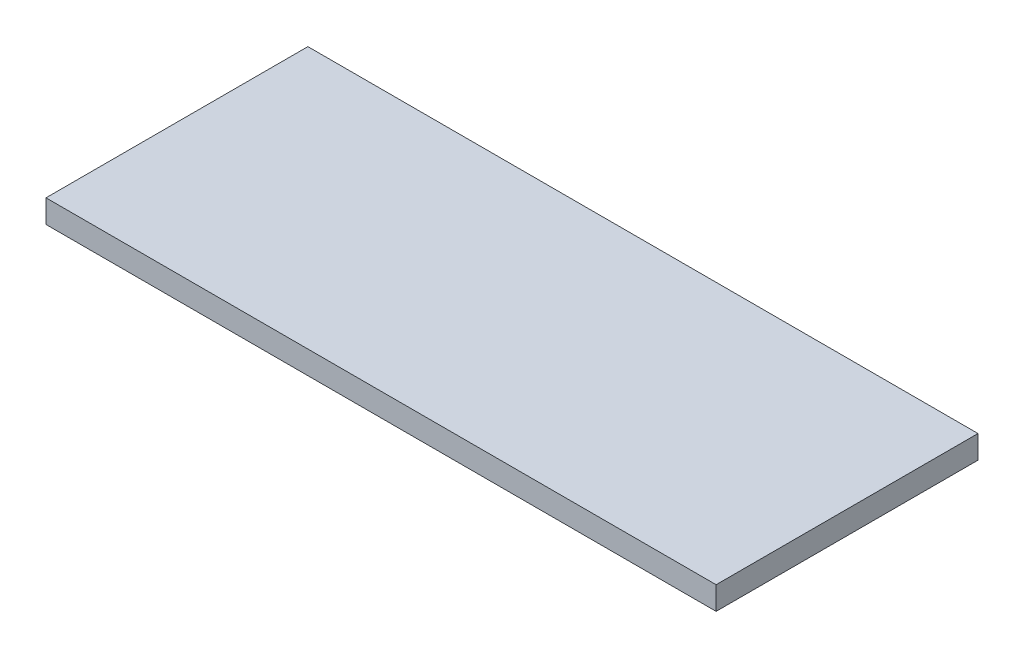
ISO-10303-21;
HEADER;
FILE_DESCRIPTION(('STEP AP214'),'2;1');
FILE_NAME('part.step','',(''),(''),'','','');
FILE_SCHEMA(('AUTOMOTIVE_DESIGN { 1 0 10303 214 1 1 1 1 }'));
ENDSEC;
DATA;
#1=APPLICATION_CONTEXT('core data for automotive mechanical design processes');
#2=APPLICATION_PROTOCOL_DEFINITION('international standard','automotive_design',2000,#1);
#3=PRODUCT_CONTEXT('',#1,'mechanical');
#4=PRODUCT('Part','Part','',(#3));
#5=PRODUCT_RELATED_PRODUCT_CATEGORY('part','',(#4));
#6=PRODUCT_DEFINITION_FORMATION('','',#4);
#7=PRODUCT_DEFINITION_CONTEXT('part definition',#1,'design');
#8=PRODUCT_DEFINITION('design','',#6,#7);
#9=PRODUCT_DEFINITION_SHAPE('','',#8);
#10=(LENGTH_UNIT() NAMED_UNIT(*) SI_UNIT(.MILLI.,.METRE.));
#11=(NAMED_UNIT(*) PLANE_ANGLE_UNIT() SI_UNIT($,.RADIAN.));
#12=(NAMED_UNIT(*) SI_UNIT($,.STERADIAN.) SOLID_ANGLE_UNIT());
#13=UNCERTAINTY_MEASURE_WITH_UNIT(LENGTH_MEASURE(1.E-05),#10,'distance_accuracy_value','');
#14=(GEOMETRIC_REPRESENTATION_CONTEXT(3) GLOBAL_UNCERTAINTY_ASSIGNED_CONTEXT((#13)) GLOBAL_UNIT_ASSIGNED_CONTEXT((#10,
#11,#12)) REPRESENTATION_CONTEXT('',''));
#15=CARTESIAN_POINT('',(0.,0.,0.));
#16=DIRECTION('',(0.,0.,1.));
#17=DIRECTION('',(1.,0.,0.));
#18=AXIS2_PLACEMENT_3D('',#15,#16,#17);
#19=CARTESIAN_POINT('',(0.,19.05,0.));
#20=DIRECTION('',(1.,0.,0.));
#21=DIRECTION('',(0.,0.,-1.));
#22=AXIS2_PLACEMENT_3D('',#19,#20,#21);
#23=PLANE('',#22);
#24=DIRECTION('',(0.,0.,1.));
#25=VECTOR('',#24,1.);
#26=CARTESIAN_POINT('',(0.,0.,0.));
#27=LINE('',#26,#25);
#28=CARTESIAN_POINT('',(0.,0.,-215.9));
#29=VERTEX_POINT('',#28);
#30=CARTESIAN_POINT('',(0.,0.,0.));
#31=VERTEX_POINT('',#30);
#32=EDGE_CURVE('E107',#29,#31,#27,.T.);
#33=ORIENTED_EDGE('',*,*,#32,.T.);
#34=DIRECTION('',(0.,-1.,0.));
#35=VECTOR('',#34,1.);
#36=CARTESIAN_POINT('',(0.,19.05,0.));
#37=LINE('',#36,#35);
#38=CARTESIAN_POINT('',(0.,19.05,0.));
#39=VERTEX_POINT('',#38);
#40=EDGE_CURVE('E11',#39,#31,#37,.T.);
#41=ORIENTED_EDGE('',*,*,#40,.F.);
#42=DIRECTION('',(0.,0.,1.));
#43=VECTOR('',#42,1.);
#44=CARTESIAN_POINT('',(0.,19.05,0.));
#45=LINE('',#44,#43);
#46=CARTESIAN_POINT('',(0.,19.05,-215.9));
#47=VERTEX_POINT('',#46);
#48=EDGE_CURVE('E91',#47,#39,#45,.T.);
#49=ORIENTED_EDGE('',*,*,#48,.F.);
#50=DIRECTION('',(0.,-1.,0.));
#51=VECTOR('',#50,1.);
#52=CARTESIAN_POINT('',(0.,19.05,-215.9));
#53=LINE('',#52,#51);
#54=EDGE_CURVE('E103',#47,#29,#53,.T.);
#55=ORIENTED_EDGE('',*,*,#54,.T.);
#56=EDGE_LOOP('',(#33,#41,#49,#55));
#57=FACE_BOUND('',#56,.T.);
#58=ADVANCED_FACE('F39',(#57),#23,.F.);
#59=CARTESIAN_POINT('',(0.,19.05,0.));
#60=DIRECTION('',(0.,0.,-1.));
#61=DIRECTION('',(-1.,0.,0.));
#62=AXIS2_PLACEMENT_3D('',#59,#60,#61);
#63=PLANE('',#62);
#64=DIRECTION('',(1.,0.,0.));
#65=VECTOR('',#64,1.);
#66=CARTESIAN_POINT('',(0.,0.,0.));
#67=LINE('',#66,#65);
#68=CARTESIAN_POINT('',(552.45,0.,0.));
#69=VERTEX_POINT('',#68);
#70=EDGE_CURVE('E96',#31,#69,#67,.T.);
#71=ORIENTED_EDGE('',*,*,#70,.T.);
#72=DIRECTION('',(0.,-1.,0.));
#73=VECTOR('',#72,1.);
#74=CARTESIAN_POINT('',(552.45,19.05,0.));
#75=LINE('',#74,#73);
#76=CARTESIAN_POINT('',(552.45,19.05,0.));
#77=VERTEX_POINT('',#76);
#78=EDGE_CURVE('E48',#77,#69,#75,.T.);
#79=ORIENTED_EDGE('',*,*,#78,.F.);
#80=DIRECTION('',(1.,0.,0.));
#81=VECTOR('',#80,1.);
#82=CARTESIAN_POINT('',(0.,19.05,0.));
#83=LINE('',#82,#81);
#84=EDGE_CURVE('E86',#39,#77,#83,.T.);
#85=ORIENTED_EDGE('',*,*,#84,.F.);
#86=ORIENTED_EDGE('',*,*,#40,.T.);
#87=EDGE_LOOP('',(#71,#79,#85,#86));
#88=FACE_BOUND('',#87,.T.);
#89=ADVANCED_FACE('F95',(#88),#63,.F.);
#90=CARTESIAN_POINT('',(552.45,19.05,0.));
#91=DIRECTION('',(-1.,0.,0.));
#92=DIRECTION('',(0.,0.,1.));
#93=AXIS2_PLACEMENT_3D('',#90,#91,#92);
#94=PLANE('',#93);
#95=DIRECTION('',(0.,0.,-1.));
#96=VECTOR('',#95,1.);
#97=CARTESIAN_POINT('',(552.45,0.,0.));
#98=LINE('',#97,#96);
#99=CARTESIAN_POINT('',(552.45,0.,-215.9));
#100=VERTEX_POINT('',#99);
#101=EDGE_CURVE('E73',#69,#100,#98,.T.);
#102=ORIENTED_EDGE('',*,*,#101,.T.);
#103=DIRECTION('',(0.,-1.,0.));
#104=VECTOR('',#103,1.);
#105=CARTESIAN_POINT('',(552.45,19.05,-215.9));
#106=LINE('',#105,#104);
#107=CARTESIAN_POINT('',(552.45,19.05,-215.9));
#108=VERTEX_POINT('',#107);
#109=EDGE_CURVE('E98',#108,#100,#106,.T.);
#110=ORIENTED_EDGE('',*,*,#109,.F.);
#111=DIRECTION('',(0.,0.,-1.));
#112=VECTOR('',#111,1.);
#113=CARTESIAN_POINT('',(552.45,19.05,0.));
#114=LINE('',#113,#112);
#115=EDGE_CURVE('E89',#77,#108,#114,.T.);
#116=ORIENTED_EDGE('',*,*,#115,.F.);
#117=ORIENTED_EDGE('',*,*,#78,.T.);
#118=EDGE_LOOP('',(#102,#110,#116,#117));
#119=FACE_BOUND('',#118,.T.);
#120=ADVANCED_FACE('F99',(#119),#94,.F.);
#121=CARTESIAN_POINT('',(0.,19.05,-215.9));
#122=DIRECTION('',(0.,0.,1.));
#123=DIRECTION('',(1.,0.,0.));
#124=AXIS2_PLACEMENT_3D('',#121,#122,#123);
#125=PLANE('',#124);
#126=DIRECTION('',(-1.,0.,0.));
#127=VECTOR('',#126,1.);
#128=CARTESIAN_POINT('',(0.,0.,-215.9));
#129=LINE('',#128,#127);
#130=EDGE_CURVE('E79',#100,#29,#129,.T.);
#131=ORIENTED_EDGE('',*,*,#130,.T.);
#132=ORIENTED_EDGE('',*,*,#54,.F.);
#133=DIRECTION('',(-1.,0.,0.));
#134=VECTOR('',#133,1.);
#135=CARTESIAN_POINT('',(0.,19.05,-215.9));
#136=LINE('',#135,#134);
#137=EDGE_CURVE('E56',#108,#47,#136,.T.);
#138=ORIENTED_EDGE('',*,*,#137,.F.);
#139=ORIENTED_EDGE('',*,*,#109,.T.);
#140=EDGE_LOOP('',(#131,#132,#138,#139));
#141=FACE_BOUND('',#140,.T.);
#142=ADVANCED_FACE('F120',(#141),#125,.F.);
#143=CARTESIAN_POINT('',(0.,19.05,0.));
#144=DIRECTION('',(0.,-1.,0.));
#145=DIRECTION('',(0.,0.,-1.));
#146=AXIS2_PLACEMENT_3D('',#143,#144,#145);
#147=PLANE('',#146);
#148=ORIENTED_EDGE('',*,*,#48,.T.);
#149=ORIENTED_EDGE('',*,*,#84,.T.);
#150=ORIENTED_EDGE('',*,*,#115,.T.);
#151=ORIENTED_EDGE('',*,*,#137,.T.);
#152=EDGE_LOOP('',(#148,#149,#150,#151));
#153=FACE_BOUND('',#152,.T.);
#154=ADVANCED_FACE('F87',(#153),#147,.F.);
#155=CARTESIAN_POINT('',(0.,0.,0.));
#156=DIRECTION('',(0.,-1.,0.));
#157=DIRECTION('',(0.,0.,-1.));
#158=AXIS2_PLACEMENT_3D('',#155,#156,#157);
#159=PLANE('',#158);
#160=ORIENTED_EDGE('',*,*,#32,.F.);
#161=ORIENTED_EDGE('',*,*,#130,.F.);
#162=ORIENTED_EDGE('',*,*,#101,.F.);
#163=ORIENTED_EDGE('',*,*,#70,.F.);
#164=EDGE_LOOP('',(#160,#161,#162,#163));
#165=FACE_BOUND('',#164,.T.);
#166=ADVANCED_FACE('F123',(#165),#159,.T.);
#167=CLOSED_SHELL('',(#58,#89,#120,#142,#154,#166));
#168=MANIFOLD_SOLID_BREP('B2',#167);
#169=ADVANCED_BREP_SHAPE_REPRESENTATION('',(#18,#168),#14);
#170=SHAPE_DEFINITION_REPRESENTATION(#9,#169);
ENDSEC;
END-ISO-10303-21;
